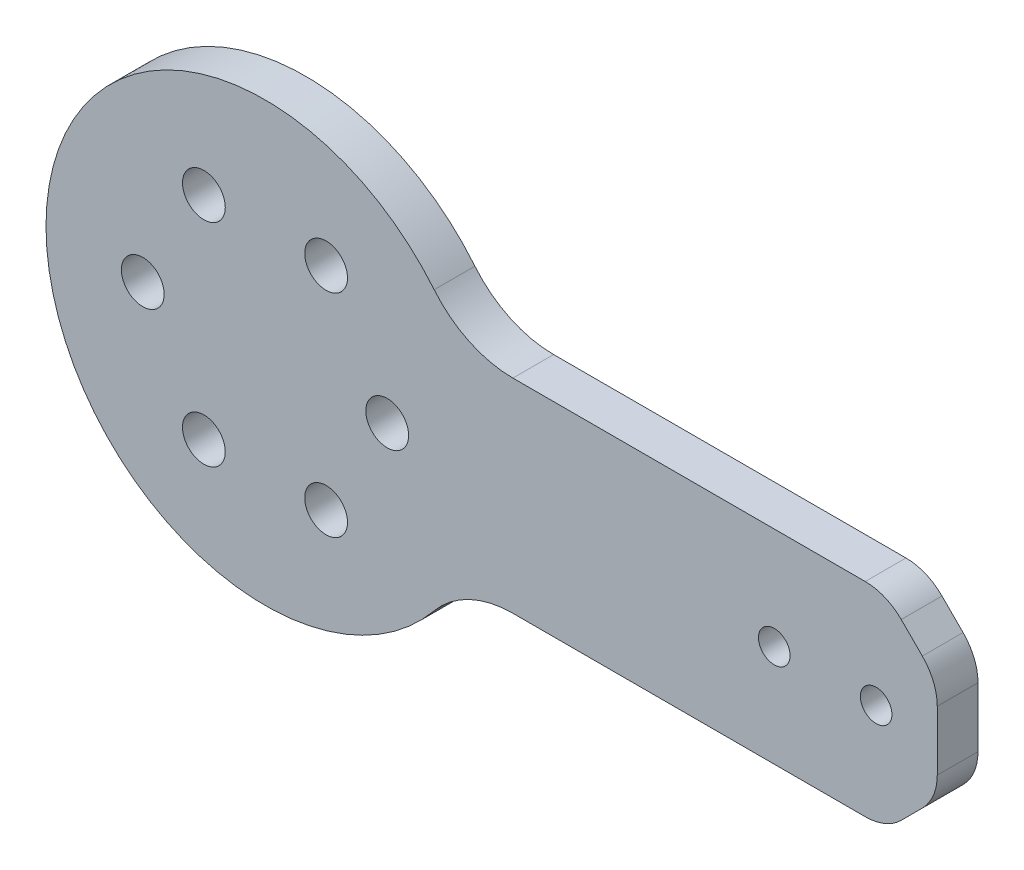
ISO-10303-21;
HEADER;
FILE_DESCRIPTION(('STEP AP214'),'2;1');
FILE_NAME('part.step','',(''),(''),'','','');
FILE_SCHEMA(('AUTOMOTIVE_DESIGN { 1 0 10303 214 1 1 1 1 }'));
ENDSEC;
DATA;
#1=APPLICATION_CONTEXT('core data for automotive mechanical design processes');
#2=APPLICATION_PROTOCOL_DEFINITION('international standard','automotive_design',2000,#1);
#3=PRODUCT_CONTEXT('',#1,'mechanical');
#4=PRODUCT('Part','Part','',(#3));
#5=PRODUCT_RELATED_PRODUCT_CATEGORY('part','',(#4));
#6=PRODUCT_DEFINITION_FORMATION('','',#4);
#7=PRODUCT_DEFINITION_CONTEXT('part definition',#1,'design');
#8=PRODUCT_DEFINITION('design','',#6,#7);
#9=PRODUCT_DEFINITION_SHAPE('','',#8);
#10=(LENGTH_UNIT() NAMED_UNIT(*) SI_UNIT(.MILLI.,.METRE.));
#11=(NAMED_UNIT(*) PLANE_ANGLE_UNIT() SI_UNIT($,.RADIAN.));
#12=(NAMED_UNIT(*) SI_UNIT($,.STERADIAN.) SOLID_ANGLE_UNIT());
#13=UNCERTAINTY_MEASURE_WITH_UNIT(LENGTH_MEASURE(1.E-05),#10,'distance_accuracy_value','');
#14=(GEOMETRIC_REPRESENTATION_CONTEXT(3) GLOBAL_UNCERTAINTY_ASSIGNED_CONTEXT((#13)) GLOBAL_UNIT_ASSIGNED_CONTEXT((#10,
#11,#12)) REPRESENTATION_CONTEXT('',''));
#15=CARTESIAN_POINT('',(0.,0.,0.));
#16=DIRECTION('',(0.,0.,1.));
#17=DIRECTION('',(1.,0.,0.));
#18=AXIS2_PLACEMENT_3D('',#15,#16,#17);
#19=CARTESIAN_POINT('',(0.,0.,-4.));
#20=DIRECTION('',(0.,0.,-1.));
#21=DIRECTION('',(1.,0.,0.));
#22=AXIS2_PLACEMENT_3D('',#19,#20,#21);
#23=PLANE('',#22);
#24=CARTESIAN_POINT('',(60.,0.,-4.));
#25=DIRECTION('',(0.,0.,1.));
#26=DIRECTION('',(1.,0.,0.));
#27=AXIS2_PLACEMENT_3D('',#24,#25,#26);
#28=CIRCLE('',#27,1.54999999999999);
#29=CARTESIAN_POINT('',(61.55,0.,-4.));
#30=VERTEX_POINT('',#29);
#31=EDGE_CURVE('E232',#30,#30,#28,.T.);
#32=ORIENTED_EDGE('',*,*,#31,.T.);
#33=EDGE_LOOP('',(#32));
#34=FACE_BOUND('',#33,.T.);
#35=CARTESIAN_POINT('',(50.,0.,-4.));
#36=DIRECTION('',(0.,0.,1.));
#37=DIRECTION('',(1.,0.,0.));
#38=AXIS2_PLACEMENT_3D('',#35,#36,#37);
#39=CIRCLE('',#38,1.55);
#40=CARTESIAN_POINT('',(51.55,0.,-4.));
#41=VERTEX_POINT('',#40);
#42=EDGE_CURVE('E253',#41,#41,#39,.T.);
#43=ORIENTED_EDGE('',*,*,#42,.T.);
#44=EDGE_LOOP('',(#43));
#45=FACE_BOUND('',#44,.T.);
#46=CARTESIAN_POINT('',(-5.9999999999999,10.3923048454133,-4.));
#47=DIRECTION('',(0.,0.,1.));
#48=DIRECTION('',(1.,0.,0.));
#49=AXIS2_PLACEMENT_3D('',#46,#47,#48);
#50=CIRCLE('',#49,2.1);
#51=CARTESIAN_POINT('',(-3.8999999999999,10.3923048454133,-4.));
#52=VERTEX_POINT('',#51);
#53=EDGE_CURVE('E238',#52,#52,#50,.T.);
#54=ORIENTED_EDGE('',*,*,#53,.T.);
#55=EDGE_LOOP('',(#54));
#56=FACE_BOUND('',#55,.T.);
#57=CARTESIAN_POINT('',(-6.00000000000005,-10.3923048454132,-4.));
#58=DIRECTION('',(0.,0.,1.));
#59=DIRECTION('',(1.,0.,0.));
#60=AXIS2_PLACEMENT_3D('',#57,#58,#59);
#61=CIRCLE('',#60,2.1);
#62=CARTESIAN_POINT('',(-3.90000000000005,-10.3923048454132,-4.));
#63=VERTEX_POINT('',#62);
#64=EDGE_CURVE('E248',#63,#63,#61,.T.);
#65=ORIENTED_EDGE('',*,*,#64,.T.);
#66=EDGE_LOOP('',(#65));
#67=FACE_BOUND('',#66,.T.);
#68=CARTESIAN_POINT('',(12.,0.,-4.));
#69=DIRECTION('',(0.,0.,1.));
#70=DIRECTION('',(1.,0.,0.));
#71=AXIS2_PLACEMENT_3D('',#68,#69,#70);
#72=CIRCLE('',#71,2.1);
#73=CARTESIAN_POINT('',(14.1,0.,-4.));
#74=VERTEX_POINT('',#73);
#75=EDGE_CURVE('E262',#74,#74,#72,.T.);
#76=ORIENTED_EDGE('',*,*,#75,.T.);
#77=EDGE_LOOP('',(#76));
#78=FACE_BOUND('',#77,.T.);
#79=DIRECTION('',(1.,0.,0.));
#80=VECTOR('',#79,1.);
#81=CARTESIAN_POINT('',(66.,-10.,-4.));
#82=LINE('',#81,#80);
#83=CARTESIAN_POINT('',(24.3361870472759,-10.,-4.));
#84=VERTEX_POINT('',#83);
#85=CARTESIAN_POINT('',(58.9289321881345,-10.,-4.));
#86=VERTEX_POINT('',#85);
#87=EDGE_CURVE('E233',#84,#86,#82,.T.);
#88=ORIENTED_EDGE('',*,*,#87,.F.);
#89=CARTESIAN_POINT('',(24.3361870472759,-20.,-4.));
#90=DIRECTION('',(0.,0.,1.));
#91=DIRECTION('',(1.,0.,0.));
#92=AXIS2_PLACEMENT_3D('',#89,#90,#91);
#93=CIRCLE('',#92,10.);
#94=CARTESIAN_POINT('',(16.610413381474,-13.6507936507937,-4.));
#95=VERTEX_POINT('',#94);
#96=EDGE_CURVE('E143',#95,#84,#93,.F.);
#97=ORIENTED_EDGE('',*,*,#96,.F.);
#98=CARTESIAN_POINT('',(0.,0.,-4.));
#99=DIRECTION('',(0.,0.,1.));
#100=DIRECTION('',(1.,0.,0.));
#101=AXIS2_PLACEMENT_3D('',#98,#99,#100);
#102=CIRCLE('',#101,21.5);
#103=CARTESIAN_POINT('',(16.610413381474,13.6507936507937,-4.));
#104=VERTEX_POINT('',#103);
#105=EDGE_CURVE('E236',#104,#95,#102,.T.);
#106=ORIENTED_EDGE('',*,*,#105,.F.);
#107=CARTESIAN_POINT('',(24.3361870472759,20.,-4.));
#108=DIRECTION('',(0.,0.,1.));
#109=DIRECTION('',(1.,0.,0.));
#110=AXIS2_PLACEMENT_3D('',#107,#108,#109);
#111=CIRCLE('',#110,10.);
#112=CARTESIAN_POINT('',(24.3361870472759,10.,-4.));
#113=VERTEX_POINT('',#112);
#114=EDGE_CURVE('E182',#113,#104,#111,.F.);
#115=ORIENTED_EDGE('',*,*,#114,.F.);
#116=DIRECTION('',(-1.,0.,0.));
#117=VECTOR('',#116,1.);
#118=CARTESIAN_POINT('',(19.0328663106743,10.,-4.));
#119=LINE('',#118,#117);
#120=CARTESIAN_POINT('',(58.9289321881345,10.,-4.));
#121=VERTEX_POINT('',#120);
#122=EDGE_CURVE('E267',#121,#113,#119,.T.);
#123=ORIENTED_EDGE('',*,*,#122,.F.);
#124=CARTESIAN_POINT('',(58.9289321881345,5.,-4.));
#125=DIRECTION('',(0.,0.,1.));
#126=DIRECTION('',(1.,0.,0.));
#127=AXIS2_PLACEMENT_3D('',#124,#125,#126);
#128=CIRCLE('',#127,5.);
#129=CARTESIAN_POINT('',(62.4644660940673,8.53553390593273,-4.));
#130=VERTEX_POINT('',#129);
#131=EDGE_CURVE('E188',#130,#121,#128,.T.);
#132=ORIENTED_EDGE('',*,*,#131,.F.);
#133=DIRECTION('',(0.707106781186547,-0.707106781186549,0.));
#134=VECTOR('',#133,1.);
#135=CARTESIAN_POINT('',(35.5000000000001,35.5,-4.));
#136=LINE('',#135,#134);
#137=CARTESIAN_POINT('',(64.5355339059328,6.46446609406725,-4.));
#138=VERTEX_POINT('',#137);
#139=EDGE_CURVE('E255',#138,#130,#136,.F.);
#140=ORIENTED_EDGE('',*,*,#139,.F.);
#141=CARTESIAN_POINT('',(61.,2.92893218813453,-4.));
#142=DIRECTION('',(0.,0.,1.));
#143=DIRECTION('',(1.,0.,0.));
#144=AXIS2_PLACEMENT_3D('',#141,#142,#143);
#145=CIRCLE('',#144,5.);
#146=CARTESIAN_POINT('',(66.,2.92893218813453,-4.));
#147=VERTEX_POINT('',#146);
#148=EDGE_CURVE('E192',#147,#138,#145,.T.);
#149=ORIENTED_EDGE('',*,*,#148,.F.);
#150=DIRECTION('',(0.,1.,0.));
#151=VECTOR('',#150,1.);
#152=CARTESIAN_POINT('',(66.,-10.,-4.));
#153=LINE('',#152,#151);
#154=CARTESIAN_POINT('',(66.,-2.92893218813453,-4.));
#155=VERTEX_POINT('',#154);
#156=EDGE_CURVE('E235',#155,#147,#153,.T.);
#157=ORIENTED_EDGE('',*,*,#156,.F.);
#158=CARTESIAN_POINT('',(61.,-2.92893218813453,-4.));
#159=DIRECTION('',(0.,0.,1.));
#160=DIRECTION('',(1.,0.,0.));
#161=AXIS2_PLACEMENT_3D('',#158,#159,#160);
#162=CIRCLE('',#161,5.);
#163=CARTESIAN_POINT('',(64.5355339059327,-6.46446609406726,-4.));
#164=VERTEX_POINT('',#163);
#165=EDGE_CURVE('E195',#164,#155,#162,.T.);
#166=ORIENTED_EDGE('',*,*,#165,.F.);
#167=DIRECTION('',(-0.707106781186548,-0.707106781186547,0.));
#168=VECTOR('',#167,1.);
#169=CARTESIAN_POINT('',(35.5,-35.5,-4.));
#170=LINE('',#169,#168);
#171=CARTESIAN_POINT('',(62.4644660940673,-8.53553390593273,-4.));
#172=VERTEX_POINT('',#171);
#173=EDGE_CURVE('E149',#172,#164,#170,.F.);
#174=ORIENTED_EDGE('',*,*,#173,.F.);
#175=CARTESIAN_POINT('',(58.9289321881345,-5.,-4.));
#176=DIRECTION('',(0.,0.,1.));
#177=DIRECTION('',(1.,0.,0.));
#178=AXIS2_PLACEMENT_3D('',#175,#176,#177);
#179=CIRCLE('',#178,5.);
#180=EDGE_CURVE('E199',#86,#172,#179,.T.);
#181=ORIENTED_EDGE('',*,*,#180,.F.);
#182=EDGE_LOOP('',(#88,#97,#106,#115,#123,#132,#140,#149,#157,#166,#174,#181));
#183=FACE_BOUND('',#182,.T.);
#184=CARTESIAN_POINT('',(5.99999999999998,-10.3923048454133,-4.));
#185=DIRECTION('',(0.,0.,1.));
#186=DIRECTION('',(1.,0.,0.));
#187=AXIS2_PLACEMENT_3D('',#184,#185,#186);
#188=CIRCLE('',#187,2.1);
#189=CARTESIAN_POINT('',(8.09999999999998,-10.3923048454133,-4.));
#190=VERTEX_POINT('',#189);
#191=EDGE_CURVE('E247',#190,#190,#188,.T.);
#192=ORIENTED_EDGE('',*,*,#191,.T.);
#193=EDGE_LOOP('',(#192));
#194=FACE_BOUND('',#193,.T.);
#195=CARTESIAN_POINT('',(-12.,0.,-4.));
#196=DIRECTION('',(0.,0.,1.));
#197=DIRECTION('',(1.,0.,0.));
#198=AXIS2_PLACEMENT_3D('',#195,#196,#197);
#199=CIRCLE('',#198,2.1);
#200=CARTESIAN_POINT('',(-9.9,0.,-4.));
#201=VERTEX_POINT('',#200);
#202=EDGE_CURVE('E304',#201,#201,#199,.T.);
#203=ORIENTED_EDGE('',*,*,#202,.T.);
#204=EDGE_LOOP('',(#203));
#205=FACE_BOUND('',#204,.T.);
#206=CARTESIAN_POINT('',(6.00000000000012,10.3923048454132,-4.));
#207=DIRECTION('',(0.,0.,1.));
#208=DIRECTION('',(1.,0.,0.));
#209=AXIS2_PLACEMENT_3D('',#206,#207,#208);
#210=CIRCLE('',#209,2.1);
#211=CARTESIAN_POINT('',(8.10000000000012,10.3923048454132,-4.));
#212=VERTEX_POINT('',#211);
#213=EDGE_CURVE('E285',#212,#212,#210,.T.);
#214=ORIENTED_EDGE('',*,*,#213,.T.);
#215=EDGE_LOOP('',(#214));
#216=FACE_BOUND('',#215,.T.);
#217=ADVANCED_FACE('F47',(#34,#45,#56,#67,#78,#183,#194,#205,#216),#23,.T.);
#218=CARTESIAN_POINT('',(0.,0.,0.));
#219=DIRECTION('',(0.,0.,-1.));
#220=DIRECTION('',(1.,0.,0.));
#221=AXIS2_PLACEMENT_3D('',#218,#219,#220);
#222=PLANE('',#221);
#223=CARTESIAN_POINT('',(60.,0.,0.));
#224=DIRECTION('',(0.,0.,1.));
#225=DIRECTION('',(1.,0.,0.));
#226=AXIS2_PLACEMENT_3D('',#223,#224,#225);
#227=CIRCLE('',#226,1.54999999999999);
#228=CARTESIAN_POINT('',(61.55,0.,0.));
#229=VERTEX_POINT('',#228);
#230=EDGE_CURVE('E286',#229,#229,#227,.T.);
#231=ORIENTED_EDGE('',*,*,#230,.F.);
#232=EDGE_LOOP('',(#231));
#233=FACE_BOUND('',#232,.T.);
#234=CARTESIAN_POINT('',(50.,0.,0.));
#235=DIRECTION('',(0.,0.,1.));
#236=DIRECTION('',(1.,0.,0.));
#237=AXIS2_PLACEMENT_3D('',#234,#235,#236);
#238=CIRCLE('',#237,1.55);
#239=CARTESIAN_POINT('',(51.55,0.,0.));
#240=VERTEX_POINT('',#239);
#241=EDGE_CURVE('E250',#240,#240,#238,.T.);
#242=ORIENTED_EDGE('',*,*,#241,.F.);
#243=EDGE_LOOP('',(#242));
#244=FACE_BOUND('',#243,.T.);
#245=DIRECTION('',(0.707106781186548,0.707106781186547,0.));
#246=VECTOR('',#245,1.);
#247=CARTESIAN_POINT('',(66.,-5.00000000000001,0.));
#248=LINE('',#247,#246);
#249=CARTESIAN_POINT('',(64.5355339059327,-6.46446609406727,0.));
#250=VERTEX_POINT('',#249);
#251=CARTESIAN_POINT('',(62.4644660940673,-8.53553390593274,0.));
#252=VERTEX_POINT('',#251);
#253=EDGE_CURVE('E257',#250,#252,#248,.F.);
#254=ORIENTED_EDGE('',*,*,#253,.F.);
#255=CARTESIAN_POINT('',(61.,-2.92893218813453,0.));
#256=DIRECTION('',(0.,0.,1.));
#257=DIRECTION('',(1.,0.,0.));
#258=AXIS2_PLACEMENT_3D('',#255,#256,#257);
#259=CIRCLE('',#258,5.);
#260=CARTESIAN_POINT('',(66.,-2.92893218813453,0.));
#261=VERTEX_POINT('',#260);
#262=EDGE_CURVE('E215',#261,#250,#259,.F.);
#263=ORIENTED_EDGE('',*,*,#262,.F.);
#264=DIRECTION('',(0.,1.,0.));
#265=VECTOR('',#264,1.);
#266=CARTESIAN_POINT('',(66.,-10.,0.));
#267=LINE('',#266,#265);
#268=CARTESIAN_POINT('',(66.,2.92893218813453,0.));
#269=VERTEX_POINT('',#268);
#270=EDGE_CURVE('E159',#261,#269,#267,.T.);
#271=ORIENTED_EDGE('',*,*,#270,.T.);
#272=CARTESIAN_POINT('',(61.,2.92893218813453,0.));
#273=DIRECTION('',(0.,0.,1.));
#274=DIRECTION('',(1.,0.,0.));
#275=AXIS2_PLACEMENT_3D('',#272,#273,#274);
#276=CIRCLE('',#275,5.);
#277=CARTESIAN_POINT('',(64.5355339059328,6.46446609406725,0.));
#278=VERTEX_POINT('',#277);
#279=EDGE_CURVE('E212',#278,#269,#276,.F.);
#280=ORIENTED_EDGE('',*,*,#279,.F.);
#281=DIRECTION('',(-0.707106781186547,0.707106781186549,0.));
#282=VECTOR('',#281,1.);
#283=CARTESIAN_POINT('',(61.,10.,0.));
#284=LINE('',#283,#282);
#285=CARTESIAN_POINT('',(62.4644660940673,8.53553390593273,0.));
#286=VERTEX_POINT('',#285);
#287=EDGE_CURVE('E269',#286,#278,#284,.F.);
#288=ORIENTED_EDGE('',*,*,#287,.F.);
#289=CARTESIAN_POINT('',(58.9289321881345,5.,0.));
#290=DIRECTION('',(0.,0.,1.));
#291=DIRECTION('',(1.,0.,0.));
#292=AXIS2_PLACEMENT_3D('',#289,#290,#291);
#293=CIRCLE('',#292,5.);
#294=CARTESIAN_POINT('',(58.9289321881345,10.,0.));
#295=VERTEX_POINT('',#294);
#296=EDGE_CURVE('E209',#295,#286,#293,.F.);
#297=ORIENTED_EDGE('',*,*,#296,.F.);
#298=DIRECTION('',(-1.,0.,0.));
#299=VECTOR('',#298,1.);
#300=CARTESIAN_POINT('',(19.0328663106743,10.,0.));
#301=LINE('',#300,#299);
#302=CARTESIAN_POINT('',(24.3361870472759,10.,0.));
#303=VERTEX_POINT('',#302);
#304=EDGE_CURVE('E290',#295,#303,#301,.T.);
#305=ORIENTED_EDGE('',*,*,#304,.T.);
#306=CARTESIAN_POINT('',(24.3361870472759,20.,0.));
#307=DIRECTION('',(0.,0.,1.));
#308=DIRECTION('',(1.,0.,0.));
#309=AXIS2_PLACEMENT_3D('',#306,#307,#308);
#310=CIRCLE('',#309,10.);
#311=CARTESIAN_POINT('',(16.610413381474,13.6507936507937,0.));
#312=VERTEX_POINT('',#311);
#313=EDGE_CURVE('E173',#312,#303,#310,.T.);
#314=ORIENTED_EDGE('',*,*,#313,.F.);
#315=CARTESIAN_POINT('',(0.,0.,0.));
#316=DIRECTION('',(0.,0.,1.));
#317=DIRECTION('',(1.,0.,0.));
#318=AXIS2_PLACEMENT_3D('',#315,#316,#317);
#319=CIRCLE('',#318,21.5);
#320=CARTESIAN_POINT('',(16.610413381474,-13.6507936507937,0.));
#321=VERTEX_POINT('',#320);
#322=EDGE_CURVE('E160',#312,#321,#319,.T.);
#323=ORIENTED_EDGE('',*,*,#322,.T.);
#324=CARTESIAN_POINT('',(24.3361870472759,-20.,0.));
#325=DIRECTION('',(0.,0.,1.));
#326=DIRECTION('',(1.,0.,0.));
#327=AXIS2_PLACEMENT_3D('',#324,#325,#326);
#328=CIRCLE('',#327,10.);
#329=CARTESIAN_POINT('',(24.3361870472759,-10.,0.));
#330=VERTEX_POINT('',#329);
#331=EDGE_CURVE('E140',#330,#321,#328,.T.);
#332=ORIENTED_EDGE('',*,*,#331,.F.);
#333=DIRECTION('',(1.,0.,0.));
#334=VECTOR('',#333,1.);
#335=CARTESIAN_POINT('',(66.,-10.,0.));
#336=LINE('',#335,#334);
#337=CARTESIAN_POINT('',(58.9289321881345,-10.,0.));
#338=VERTEX_POINT('',#337);
#339=EDGE_CURVE('E152',#330,#338,#336,.T.);
#340=ORIENTED_EDGE('',*,*,#339,.T.);
#341=CARTESIAN_POINT('',(58.9289321881345,-5.,0.));
#342=DIRECTION('',(0.,0.,1.));
#343=DIRECTION('',(1.,0.,0.));
#344=AXIS2_PLACEMENT_3D('',#341,#342,#343);
#345=CIRCLE('',#344,5.);
#346=EDGE_CURVE('E219',#252,#338,#345,.F.);
#347=ORIENTED_EDGE('',*,*,#346,.F.);
#348=EDGE_LOOP('',(#254,#263,#271,#280,#288,#297,#305,#314,#323,#332,#340,#347));
#349=FACE_BOUND('',#348,.T.);
#350=CARTESIAN_POINT('',(12.,0.,0.));
#351=DIRECTION('',(0.,0.,1.));
#352=DIRECTION('',(1.,0.,0.));
#353=AXIS2_PLACEMENT_3D('',#350,#351,#352);
#354=CIRCLE('',#353,2.1);
#355=CARTESIAN_POINT('',(14.1,0.,0.));
#356=VERTEX_POINT('',#355);
#357=EDGE_CURVE('E259',#356,#356,#354,.T.);
#358=ORIENTED_EDGE('',*,*,#357,.F.);
#359=EDGE_LOOP('',(#358));
#360=FACE_BOUND('',#359,.T.);
#361=CARTESIAN_POINT('',(5.99999999999998,-10.3923048454133,0.));
#362=DIRECTION('',(0.,0.,1.));
#363=DIRECTION('',(1.,0.,0.));
#364=AXIS2_PLACEMENT_3D('',#361,#362,#363);
#365=CIRCLE('',#364,2.1);
#366=CARTESIAN_POINT('',(8.09999999999998,-10.3923048454133,0.));
#367=VERTEX_POINT('',#366);
#368=EDGE_CURVE('E244',#367,#367,#365,.T.);
#369=ORIENTED_EDGE('',*,*,#368,.F.);
#370=EDGE_LOOP('',(#369));
#371=FACE_BOUND('',#370,.T.);
#372=CARTESIAN_POINT('',(-6.00000000000005,-10.3923048454132,0.));
#373=DIRECTION('',(0.,0.,1.));
#374=DIRECTION('',(1.,0.,0.));
#375=AXIS2_PLACEMENT_3D('',#372,#373,#374);
#376=CIRCLE('',#375,2.1);
#377=CARTESIAN_POINT('',(-3.90000000000005,-10.3923048454132,0.));
#378=VERTEX_POINT('',#377);
#379=EDGE_CURVE('E319',#378,#378,#376,.T.);
#380=ORIENTED_EDGE('',*,*,#379,.F.);
#381=EDGE_LOOP('',(#380));
#382=FACE_BOUND('',#381,.T.);
#383=CARTESIAN_POINT('',(-12.,0.,0.));
#384=DIRECTION('',(0.,0.,1.));
#385=DIRECTION('',(1.,0.,0.));
#386=AXIS2_PLACEMENT_3D('',#383,#384,#385);
#387=CIRCLE('',#386,2.1);
#388=CARTESIAN_POINT('',(-9.9,0.,0.));
#389=VERTEX_POINT('',#388);
#390=EDGE_CURVE('E240',#389,#389,#387,.T.);
#391=ORIENTED_EDGE('',*,*,#390,.F.);
#392=EDGE_LOOP('',(#391));
#393=FACE_BOUND('',#392,.T.);
#394=CARTESIAN_POINT('',(-5.9999999999999,10.3923048454133,0.));
#395=DIRECTION('',(0.,0.,1.));
#396=DIRECTION('',(1.,0.,0.));
#397=AXIS2_PLACEMENT_3D('',#394,#395,#396);
#398=CIRCLE('',#397,2.1);
#399=CARTESIAN_POINT('',(-3.8999999999999,10.3923048454133,0.));
#400=VERTEX_POINT('',#399);
#401=EDGE_CURVE('E241',#400,#400,#398,.T.);
#402=ORIENTED_EDGE('',*,*,#401,.F.);
#403=EDGE_LOOP('',(#402));
#404=FACE_BOUND('',#403,.T.);
#405=CARTESIAN_POINT('',(6.00000000000012,10.3923048454132,0.));
#406=DIRECTION('',(0.,0.,1.));
#407=DIRECTION('',(1.,0.,0.));
#408=AXIS2_PLACEMENT_3D('',#405,#406,#407);
#409=CIRCLE('',#408,2.1);
#410=CARTESIAN_POINT('',(8.10000000000012,10.3923048454132,0.));
#411=VERTEX_POINT('',#410);
#412=EDGE_CURVE('E282',#411,#411,#409,.T.);
#413=ORIENTED_EDGE('',*,*,#412,.F.);
#414=EDGE_LOOP('',(#413));
#415=FACE_BOUND('',#414,.T.);
#416=ADVANCED_FACE('F163',(#233,#244,#349,#360,#371,#382,#393,#404,#415),#222,.F.);
#417=CARTESIAN_POINT('',(0.,0.,-4.));
#418=DIRECTION('',(0.,0.,1.));
#419=DIRECTION('',(-1.,0.,0.));
#420=AXIS2_PLACEMENT_3D('',#417,#418,#419);
#421=CYLINDRICAL_SURFACE('',#420,21.5);
#422=ORIENTED_EDGE('',*,*,#322,.F.);
#423=DIRECTION('',(0.,0.,1.));
#424=VECTOR('',#423,1.);
#425=CARTESIAN_POINT('',(16.610413381474,13.6507936507937,-4.));
#426=LINE('',#425,#424);
#427=EDGE_CURVE('E148',#104,#312,#426,.T.);
#428=ORIENTED_EDGE('',*,*,#427,.F.);
#429=ORIENTED_EDGE('',*,*,#105,.T.);
#430=DIRECTION('',(0.,0.,1.));
#431=VECTOR('',#430,1.);
#432=CARTESIAN_POINT('',(16.610413381474,-13.6507936507937,-4.));
#433=LINE('',#432,#431);
#434=EDGE_CURVE('E176',#321,#95,#433,.F.);
#435=ORIENTED_EDGE('',*,*,#434,.F.);
#436=EDGE_LOOP('',(#422,#428,#429,#435));
#437=FACE_BOUND('',#436,.T.);
#438=ADVANCED_FACE('F346',(#437),#421,.T.);
#439=CARTESIAN_POINT('',(66.,-10.,-4.));
#440=DIRECTION('',(0.,1.,0.));
#441=DIRECTION('',(-1.,0.,0.));
#442=AXIS2_PLACEMENT_3D('',#439,#440,#441);
#443=PLANE('',#442);
#444=ORIENTED_EDGE('',*,*,#339,.F.);
#445=DIRECTION('',(0.,0.,-1.));
#446=VECTOR('',#445,1.);
#447=CARTESIAN_POINT('',(24.3361870472759,-10.,0.));
#448=LINE('',#447,#446);
#449=EDGE_CURVE('E136',#84,#330,#448,.F.);
#450=ORIENTED_EDGE('',*,*,#449,.F.);
#451=ORIENTED_EDGE('',*,*,#87,.T.);
#452=DIRECTION('',(0.,0.,1.));
#453=VECTOR('',#452,1.);
#454=CARTESIAN_POINT('',(58.9289321881345,-10.,-4.));
#455=LINE('',#454,#453);
#456=EDGE_CURVE('E154',#338,#86,#455,.F.);
#457=ORIENTED_EDGE('',*,*,#456,.F.);
#458=EDGE_LOOP('',(#444,#450,#451,#457));
#459=FACE_BOUND('',#458,.T.);
#460=ADVANCED_FACE('F153',(#459),#443,.F.);
#461=CARTESIAN_POINT('',(66.,-10.,-4.));
#462=DIRECTION('',(-1.,0.,0.));
#463=DIRECTION('',(0.,0.,-1.));
#464=AXIS2_PLACEMENT_3D('',#461,#462,#463);
#465=PLANE('',#464);
#466=ORIENTED_EDGE('',*,*,#156,.T.);
#467=DIRECTION('',(0.,0.,1.));
#468=VECTOR('',#467,1.);
#469=CARTESIAN_POINT('',(66.,2.92893218813453,-4.));
#470=LINE('',#469,#468);
#471=EDGE_CURVE('E222',#269,#147,#470,.F.);
#472=ORIENTED_EDGE('',*,*,#471,.F.);
#473=ORIENTED_EDGE('',*,*,#270,.F.);
#474=DIRECTION('',(0.,0.,-1.));
#475=VECTOR('',#474,1.);
#476=CARTESIAN_POINT('',(66.,-2.92893218813453,0.));
#477=LINE('',#476,#475);
#478=EDGE_CURVE('E225',#155,#261,#477,.F.);
#479=ORIENTED_EDGE('',*,*,#478,.F.);
#480=EDGE_LOOP('',(#466,#472,#473,#479));
#481=FACE_BOUND('',#480,.T.);
#482=ADVANCED_FACE('F387',(#481),#465,.F.);
#483=CARTESIAN_POINT('',(19.0328663106743,10.,-4.));
#484=DIRECTION('',(0.,-1.,0.));
#485=DIRECTION('',(0.,0.,1.));
#486=AXIS2_PLACEMENT_3D('',#483,#484,#485);
#487=PLANE('',#486);
#488=ORIENTED_EDGE('',*,*,#122,.T.);
#489=DIRECTION('',(0.,0.,-1.));
#490=VECTOR('',#489,1.);
#491=CARTESIAN_POINT('',(24.3361870472759,10.,-4.));
#492=LINE('',#491,#490);
#493=EDGE_CURVE('E168',#303,#113,#492,.T.);
#494=ORIENTED_EDGE('',*,*,#493,.F.);
#495=ORIENTED_EDGE('',*,*,#304,.F.);
#496=DIRECTION('',(0.,0.,-1.));
#497=VECTOR('',#496,1.);
#498=CARTESIAN_POINT('',(58.9289321881345,10.,0.));
#499=LINE('',#498,#497);
#500=EDGE_CURVE('E11',#121,#295,#499,.F.);
#501=ORIENTED_EDGE('',*,*,#500,.F.);
#502=EDGE_LOOP('',(#488,#494,#495,#501));
#503=FACE_BOUND('',#502,.T.);
#504=ADVANCED_FACE('F341',(#503),#487,.F.);
#505=CARTESIAN_POINT('',(12.,0.,-4.));
#506=DIRECTION('',(0.,0.,1.));
#507=DIRECTION('',(-1.,0.,0.));
#508=AXIS2_PLACEMENT_3D('',#505,#506,#507);
#509=CYLINDRICAL_SURFACE('',#508,2.1);
#510=ORIENTED_EDGE('',*,*,#75,.F.);
#511=EDGE_LOOP('',(#510));
#512=FACE_BOUND('',#511,.T.);
#513=ORIENTED_EDGE('',*,*,#357,.T.);
#514=EDGE_LOOP('',(#513));
#515=FACE_BOUND('',#514,.T.);
#516=ADVANCED_FACE('F337',(#512,#515),#509,.F.);
#517=CARTESIAN_POINT('',(5.99999999999998,-10.3923048454133,-4.));
#518=DIRECTION('',(0.,0.,1.));
#519=DIRECTION('',(-1.,0.,0.));
#520=AXIS2_PLACEMENT_3D('',#517,#518,#519);
#521=CYLINDRICAL_SURFACE('',#520,2.1);
#522=ORIENTED_EDGE('',*,*,#191,.F.);
#523=EDGE_LOOP('',(#522));
#524=FACE_BOUND('',#523,.T.);
#525=ORIENTED_EDGE('',*,*,#368,.T.);
#526=EDGE_LOOP('',(#525));
#527=FACE_BOUND('',#526,.T.);
#528=ADVANCED_FACE('F340',(#524,#527),#521,.F.);
#529=CARTESIAN_POINT('',(-6.00000000000005,-10.3923048454132,-4.));
#530=DIRECTION('',(0.,0.,1.));
#531=DIRECTION('',(-1.,0.,0.));
#532=AXIS2_PLACEMENT_3D('',#529,#530,#531);
#533=CYLINDRICAL_SURFACE('',#532,2.1);
#534=ORIENTED_EDGE('',*,*,#64,.F.);
#535=EDGE_LOOP('',(#534));
#536=FACE_BOUND('',#535,.T.);
#537=ORIENTED_EDGE('',*,*,#379,.T.);
#538=EDGE_LOOP('',(#537));
#539=FACE_BOUND('',#538,.T.);
#540=ADVANCED_FACE('F444',(#536,#539),#533,.F.);
#541=CARTESIAN_POINT('',(-12.,0.,-4.));
#542=DIRECTION('',(0.,0.,1.));
#543=DIRECTION('',(-1.,0.,0.));
#544=AXIS2_PLACEMENT_3D('',#541,#542,#543);
#545=CYLINDRICAL_SURFACE('',#544,2.1);
#546=ORIENTED_EDGE('',*,*,#202,.F.);
#547=EDGE_LOOP('',(#546));
#548=FACE_BOUND('',#547,.T.);
#549=ORIENTED_EDGE('',*,*,#390,.T.);
#550=EDGE_LOOP('',(#549));
#551=FACE_BOUND('',#550,.T.);
#552=ADVANCED_FACE('F371',(#548,#551),#545,.F.);
#553=CARTESIAN_POINT('',(-5.9999999999999,10.3923048454133,-4.));
#554=DIRECTION('',(0.,0.,1.));
#555=DIRECTION('',(-1.,0.,0.));
#556=AXIS2_PLACEMENT_3D('',#553,#554,#555);
#557=CYLINDRICAL_SURFACE('',#556,2.1);
#558=ORIENTED_EDGE('',*,*,#53,.F.);
#559=EDGE_LOOP('',(#558));
#560=FACE_BOUND('',#559,.T.);
#561=ORIENTED_EDGE('',*,*,#401,.T.);
#562=EDGE_LOOP('',(#561));
#563=FACE_BOUND('',#562,.T.);
#564=ADVANCED_FACE('F361',(#560,#563),#557,.F.);
#565=CARTESIAN_POINT('',(6.00000000000012,10.3923048454132,-4.));
#566=DIRECTION('',(0.,0.,1.));
#567=DIRECTION('',(-1.,0.,0.));
#568=AXIS2_PLACEMENT_3D('',#565,#566,#567);
#569=CYLINDRICAL_SURFACE('',#568,2.1);
#570=ORIENTED_EDGE('',*,*,#213,.F.);
#571=EDGE_LOOP('',(#570));
#572=FACE_BOUND('',#571,.T.);
#573=ORIENTED_EDGE('',*,*,#412,.T.);
#574=EDGE_LOOP('',(#573));
#575=FACE_BOUND('',#574,.T.);
#576=ADVANCED_FACE('F358',(#572,#575),#569,.F.);
#577=CARTESIAN_POINT('',(66.,-5.00000000000001,-4.));
#578=DIRECTION('',(-0.707106781186547,0.707106781186548,0.));
#579=DIRECTION('',(0.,0.,1.));
#580=AXIS2_PLACEMENT_3D('',#577,#578,#579);
#581=PLANE('',#580);
#582=ORIENTED_EDGE('',*,*,#173,.T.);
#583=DIRECTION('',(0.,0.,1.));
#584=VECTOR('',#583,1.);
#585=CARTESIAN_POINT('',(64.5355339059327,-6.46446609406727,-4.));
#586=LINE('',#585,#584);
#587=EDGE_CURVE('E203',#250,#164,#586,.F.);
#588=ORIENTED_EDGE('',*,*,#587,.F.);
#589=ORIENTED_EDGE('',*,*,#253,.T.);
#590=DIRECTION('',(0.,0.,-1.));
#591=VECTOR('',#590,1.);
#592=CARTESIAN_POINT('',(62.4644660940673,-8.53553390593274,0.));
#593=LINE('',#592,#591);
#594=EDGE_CURVE('E206',#172,#252,#593,.F.);
#595=ORIENTED_EDGE('',*,*,#594,.F.);
#596=EDGE_LOOP('',(#582,#588,#589,#595));
#597=FACE_BOUND('',#596,.T.);
#598=ADVANCED_FACE('F360',(#597),#581,.F.);
#599=CARTESIAN_POINT('',(61.,10.,-4.));
#600=DIRECTION('',(-0.707106781186548,-0.707106781186546,0.));
#601=DIRECTION('',(0.,0.,1.));
#602=AXIS2_PLACEMENT_3D('',#599,#600,#601);
#603=PLANE('',#602);
#604=ORIENTED_EDGE('',*,*,#139,.T.);
#605=DIRECTION('',(0.,0.,1.));
#606=VECTOR('',#605,1.);
#607=CARTESIAN_POINT('',(62.4644660940673,8.53553390593273,-4.));
#608=LINE('',#607,#606);
#609=EDGE_CURVE('E69',#286,#130,#608,.F.);
#610=ORIENTED_EDGE('',*,*,#609,.F.);
#611=ORIENTED_EDGE('',*,*,#287,.T.);
#612=DIRECTION('',(0.,0.,-1.));
#613=VECTOR('',#612,1.);
#614=CARTESIAN_POINT('',(64.5355339059328,6.46446609406725,0.));
#615=LINE('',#614,#613);
#616=EDGE_CURVE('E56',#138,#278,#615,.F.);
#617=ORIENTED_EDGE('',*,*,#616,.F.);
#618=EDGE_LOOP('',(#604,#610,#611,#617));
#619=FACE_BOUND('',#618,.T.);
#620=ADVANCED_FACE('F368',(#619),#603,.F.);
#621=CARTESIAN_POINT('',(50.,0.,0.));
#622=DIRECTION('',(0.,0.,-1.));
#623=DIRECTION('',(1.,0.,0.));
#624=AXIS2_PLACEMENT_3D('',#621,#622,#623);
#625=CYLINDRICAL_SURFACE('',#624,1.55);
#626=ORIENTED_EDGE('',*,*,#241,.T.);
#627=EDGE_LOOP('',(#626));
#628=FACE_BOUND('',#627,.T.);
#629=ORIENTED_EDGE('',*,*,#42,.F.);
#630=EDGE_LOOP('',(#629));
#631=FACE_BOUND('',#630,.T.);
#632=ADVANCED_FACE('F399',(#628,#631),#625,.F.);
#633=CARTESIAN_POINT('',(60.,0.,0.));
#634=DIRECTION('',(0.,0.,-1.));
#635=DIRECTION('',(1.,0.,0.));
#636=AXIS2_PLACEMENT_3D('',#633,#634,#635);
#637=CYLINDRICAL_SURFACE('',#636,1.54999999999999);
#638=ORIENTED_EDGE('',*,*,#230,.T.);
#639=EDGE_LOOP('',(#638));
#640=FACE_BOUND('',#639,.T.);
#641=ORIENTED_EDGE('',*,*,#31,.F.);
#642=EDGE_LOOP('',(#641));
#643=FACE_BOUND('',#642,.T.);
#644=ADVANCED_FACE('F403',(#640,#643),#637,.F.);
#645=CARTESIAN_POINT('',(24.3361870472759,-20.,-4.));
#646=DIRECTION('',(0.,0.,1.));
#647=DIRECTION('',(-1.,0.,0.));
#648=AXIS2_PLACEMENT_3D('',#645,#646,#647);
#649=CYLINDRICAL_SURFACE('',#648,10.);
#650=ORIENTED_EDGE('',*,*,#96,.T.);
#651=ORIENTED_EDGE('',*,*,#449,.T.);
#652=ORIENTED_EDGE('',*,*,#331,.T.);
#653=ORIENTED_EDGE('',*,*,#434,.T.);
#654=EDGE_LOOP('',(#650,#651,#652,#653));
#655=FACE_BOUND('',#654,.T.);
#656=ADVANCED_FACE('F138',(#655),#649,.F.);
#657=CARTESIAN_POINT('',(24.3361870472759,20.,-4.));
#658=DIRECTION('',(0.,0.,1.));
#659=DIRECTION('',(-1.,0.,0.));
#660=AXIS2_PLACEMENT_3D('',#657,#658,#659);
#661=CYLINDRICAL_SURFACE('',#660,10.);
#662=ORIENTED_EDGE('',*,*,#114,.T.);
#663=ORIENTED_EDGE('',*,*,#427,.T.);
#664=ORIENTED_EDGE('',*,*,#313,.T.);
#665=ORIENTED_EDGE('',*,*,#493,.T.);
#666=EDGE_LOOP('',(#662,#663,#664,#665));
#667=FACE_BOUND('',#666,.T.);
#668=ADVANCED_FACE('F402',(#667),#661,.F.);
#669=CARTESIAN_POINT('',(58.9289321881345,-5.,-4.));
#670=DIRECTION('',(0.,0.,-1.));
#671=DIRECTION('',(1.,0.,0.));
#672=AXIS2_PLACEMENT_3D('',#669,#670,#671);
#673=CYLINDRICAL_SURFACE('',#672,5.);
#674=ORIENTED_EDGE('',*,*,#346,.T.);
#675=ORIENTED_EDGE('',*,*,#456,.T.);
#676=ORIENTED_EDGE('',*,*,#180,.T.);
#677=ORIENTED_EDGE('',*,*,#594,.T.);
#678=EDGE_LOOP('',(#674,#675,#676,#677));
#679=FACE_BOUND('',#678,.T.);
#680=ADVANCED_FACE('F406',(#679),#673,.T.);
#681=CARTESIAN_POINT('',(61.,-2.92893218813453,-4.));
#682=DIRECTION('',(0.,0.,1.));
#683=DIRECTION('',(-1.,0.,0.));
#684=AXIS2_PLACEMENT_3D('',#681,#682,#683);
#685=CYLINDRICAL_SURFACE('',#684,5.);
#686=ORIENTED_EDGE('',*,*,#165,.T.);
#687=ORIENTED_EDGE('',*,*,#478,.T.);
#688=ORIENTED_EDGE('',*,*,#262,.T.);
#689=ORIENTED_EDGE('',*,*,#587,.T.);
#690=EDGE_LOOP('',(#686,#687,#688,#689));
#691=FACE_BOUND('',#690,.T.);
#692=ADVANCED_FACE('F410',(#691),#685,.T.);
#693=CARTESIAN_POINT('',(61.,2.92893218813453,-4.));
#694=DIRECTION('',(0.,0.,-1.));
#695=DIRECTION('',(1.,0.,0.));
#696=AXIS2_PLACEMENT_3D('',#693,#694,#695);
#697=CYLINDRICAL_SURFACE('',#696,5.);
#698=ORIENTED_EDGE('',*,*,#279,.T.);
#699=ORIENTED_EDGE('',*,*,#471,.T.);
#700=ORIENTED_EDGE('',*,*,#148,.T.);
#701=ORIENTED_EDGE('',*,*,#616,.T.);
#702=EDGE_LOOP('',(#698,#699,#700,#701));
#703=FACE_BOUND('',#702,.T.);
#704=ADVANCED_FACE('F413',(#703),#697,.T.);
#705=CARTESIAN_POINT('',(58.9289321881345,5.,-4.));
#706=DIRECTION('',(0.,0.,1.));
#707=DIRECTION('',(-1.,0.,0.));
#708=AXIS2_PLACEMENT_3D('',#705,#706,#707);
#709=CYLINDRICAL_SURFACE('',#708,5.);
#710=ORIENTED_EDGE('',*,*,#131,.T.);
#711=ORIENTED_EDGE('',*,*,#500,.T.);
#712=ORIENTED_EDGE('',*,*,#296,.T.);
#713=ORIENTED_EDGE('',*,*,#609,.T.);
#714=EDGE_LOOP('',(#710,#711,#712,#713));
#715=FACE_BOUND('',#714,.T.);
#716=ADVANCED_FACE('F49',(#715),#709,.T.);
#717=CLOSED_SHELL('',(#217,#416,#438,#460,#482,#504,#516,#528,#540,#552,#564,#576,#598,#620,
#632,#644,#656,#668,#680,#692,#704,#716));
#718=MANIFOLD_SOLID_BREP('B2',#717);
#719=ADVANCED_BREP_SHAPE_REPRESENTATION('',(#18,#718),#14);
#720=SHAPE_DEFINITION_REPRESENTATION(#9,#719);
ENDSEC;
END-ISO-10303-21;
